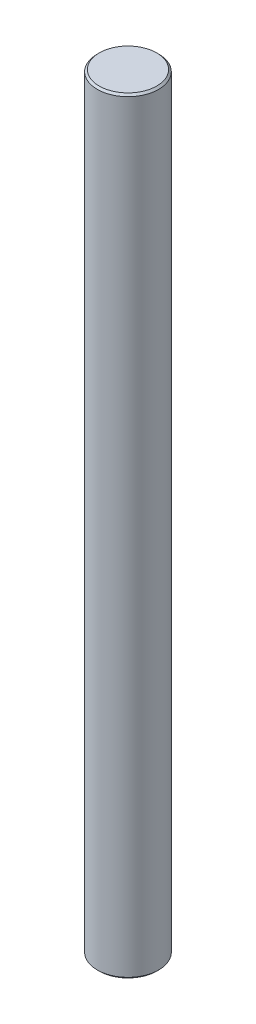
ISO-10303-21;
HEADER;
FILE_DESCRIPTION(('STEP AP214'),'2;1');
FILE_NAME('part.step','',(''),(''),'','','');
FILE_SCHEMA(('AUTOMOTIVE_DESIGN { 1 0 10303 214 1 1 1 1 }'));
ENDSEC;
DATA;
#1=APPLICATION_CONTEXT('core data for automotive mechanical design processes');
#2=APPLICATION_PROTOCOL_DEFINITION('international standard','automotive_design',2000,#1);
#3=PRODUCT_CONTEXT('',#1,'mechanical');
#4=PRODUCT('Part','Part','',(#3));
#5=PRODUCT_RELATED_PRODUCT_CATEGORY('part','',(#4));
#6=PRODUCT_DEFINITION_FORMATION('','',#4);
#7=PRODUCT_DEFINITION_CONTEXT('part definition',#1,'design');
#8=PRODUCT_DEFINITION('design','',#6,#7);
#9=PRODUCT_DEFINITION_SHAPE('','',#8);
#10=(LENGTH_UNIT() NAMED_UNIT(*) SI_UNIT(.MILLI.,.METRE.));
#11=(NAMED_UNIT(*) PLANE_ANGLE_UNIT() SI_UNIT($,.RADIAN.));
#12=(NAMED_UNIT(*) SI_UNIT($,.STERADIAN.) SOLID_ANGLE_UNIT());
#13=UNCERTAINTY_MEASURE_WITH_UNIT(LENGTH_MEASURE(1.E-05),#10,'distance_accuracy_value','');
#14=(GEOMETRIC_REPRESENTATION_CONTEXT(3) GLOBAL_UNCERTAINTY_ASSIGNED_CONTEXT((#13)) GLOBAL_UNIT_ASSIGNED_CONTEXT((#10,
#11,#12)) REPRESENTATION_CONTEXT('',''));
#15=CARTESIAN_POINT('',(0.,0.,0.));
#16=DIRECTION('',(0.,0.,1.));
#17=DIRECTION('',(1.,0.,0.));
#18=AXIS2_PLACEMENT_3D('',#15,#16,#17);
#19=CARTESIAN_POINT('',(0.,100.,0.));
#20=DIRECTION('',(0.,-1.,0.));
#21=DIRECTION('',(0.,0.,-1.));
#22=AXIS2_PLACEMENT_3D('',#19,#20,#21);
#23=CYLINDRICAL_SURFACE('',#22,4.);
#24=CARTESIAN_POINT('',(0.,99.75,0.));
#25=DIRECTION('',(0.,1.,0.));
#26=DIRECTION('',(0.,0.,1.));
#27=AXIS2_PLACEMENT_3D('',#24,#25,#26);
#28=CIRCLE('',#27,4.);
#29=CARTESIAN_POINT('',(0.,99.75,4.));
#30=VERTEX_POINT('',#29);
#31=EDGE_CURVE('E45',#30,#30,#28,.F.);
#32=ORIENTED_EDGE('',*,*,#31,.T.);
#33=EDGE_LOOP('',(#32));
#34=FACE_BOUND('',#33,.T.);
#35=CARTESIAN_POINT('',(0.,0.250000000000014,0.));
#36=DIRECTION('',(0.,1.,0.));
#37=DIRECTION('',(0.,0.,1.));
#38=AXIS2_PLACEMENT_3D('',#35,#36,#37);
#39=CIRCLE('',#38,4.);
#40=CARTESIAN_POINT('',(0.,0.250000000000014,4.));
#41=VERTEX_POINT('',#40);
#42=EDGE_CURVE('E50',#41,#41,#39,.T.);
#43=ORIENTED_EDGE('',*,*,#42,.T.);
#44=EDGE_LOOP('',(#43));
#45=FACE_BOUND('',#44,.T.);
#46=ADVANCED_FACE('F37',(#34,#45),#23,.T.);
#47=CARTESIAN_POINT('',(0.,100.,0.));
#48=DIRECTION('',(0.,1.,0.));
#49=DIRECTION('',(0.,0.,1.));
#50=AXIS2_PLACEMENT_3D('',#47,#48,#49);
#51=PLANE('',#50);
#52=CARTESIAN_POINT('',(0.,100.,0.));
#53=DIRECTION('',(0.,1.,0.));
#54=DIRECTION('',(0.,0.,1.));
#55=AXIS2_PLACEMENT_3D('',#52,#53,#54);
#56=CIRCLE('',#55,3.75000000000002);
#57=CARTESIAN_POINT('',(0.,100.,3.75000000000002));
#58=VERTEX_POINT('',#57);
#59=EDGE_CURVE('E55',#58,#58,#56,.T.);
#60=ORIENTED_EDGE('',*,*,#59,.T.);
#61=EDGE_LOOP('',(#60));
#62=FACE_BOUND('',#61,.T.);
#63=ADVANCED_FACE('F62',(#62),#51,.T.);
#64=CARTESIAN_POINT('',(0.,0.,0.));
#65=DIRECTION('',(0.,1.,0.));
#66=DIRECTION('',(0.,0.,1.));
#67=AXIS2_PLACEMENT_3D('',#64,#65,#66);
#68=PLANE('',#67);
#69=CARTESIAN_POINT('',(0.,0.,0.));
#70=DIRECTION('',(0.,1.,0.));
#71=DIRECTION('',(0.,0.,1.));
#72=AXIS2_PLACEMENT_3D('',#69,#70,#71);
#73=CIRCLE('',#72,3.74999999999999);
#74=CARTESIAN_POINT('',(0.,0.,3.74999999999999));
#75=VERTEX_POINT('',#74);
#76=EDGE_CURVE('E10',#75,#75,#73,.F.);
#77=ORIENTED_EDGE('',*,*,#76,.T.);
#78=EDGE_LOOP('',(#77));
#79=FACE_BOUND('',#78,.T.);
#80=ADVANCED_FACE('F66',(#79),#68,.F.);
#81=CARTESIAN_POINT('',(0.,100.,0.));
#82=DIRECTION('',(0.,-1.,0.));
#83=DIRECTION('',(0.,0.,-1.));
#84=AXIS2_PLACEMENT_3D('',#81,#82,#83);
#85=CONICAL_SURFACE('',#84,3.75000000000002,0.785398163397414);
#86=ORIENTED_EDGE('',*,*,#31,.F.);
#87=EDGE_LOOP('',(#86));
#88=FACE_BOUND('',#87,.T.);
#89=ORIENTED_EDGE('',*,*,#59,.F.);
#90=EDGE_LOOP('',(#89));
#91=FACE_BOUND('',#90,.T.);
#92=ADVANCED_FACE('F64',(#88,#91),#85,.T.);
#93=CARTESIAN_POINT('',(0.,0.250000000000014,0.));
#94=DIRECTION('',(0.,1.,0.));
#95=DIRECTION('',(0.,0.,1.));
#96=AXIS2_PLACEMENT_3D('',#93,#94,#95);
#97=CONICAL_SURFACE('',#96,4.,0.785398163397441);
#98=ORIENTED_EDGE('',*,*,#76,.F.);
#99=EDGE_LOOP('',(#98));
#100=FACE_BOUND('',#99,.T.);
#101=ORIENTED_EDGE('',*,*,#42,.F.);
#102=EDGE_LOOP('',(#101));
#103=FACE_BOUND('',#102,.T.);
#104=ADVANCED_FACE('F39',(#100,#103),#97,.T.);
#105=CLOSED_SHELL('',(#46,#63,#80,#92,#104));
#106=MANIFOLD_SOLID_BREP('B2',#105);
#107=ADVANCED_BREP_SHAPE_REPRESENTATION('',(#18,#106),#14);
#108=SHAPE_DEFINITION_REPRESENTATION(#9,#107);
ENDSEC;
END-ISO-10303-21;
